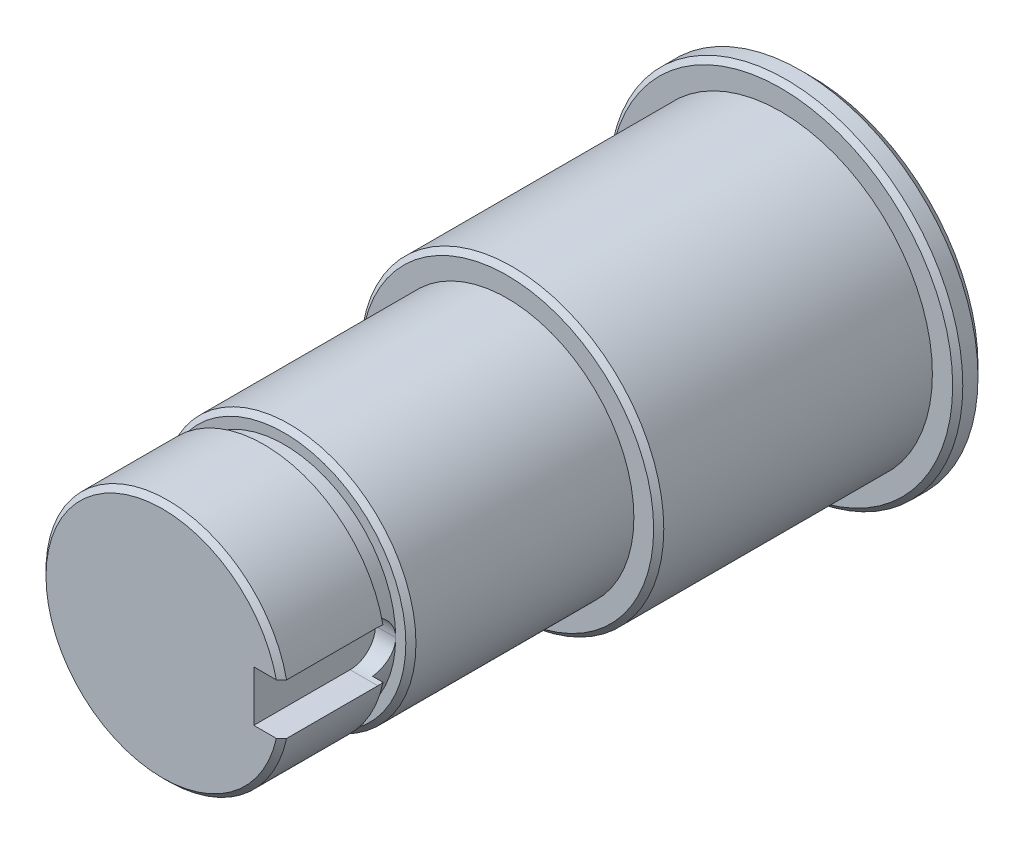
ISO-10303-21;
HEADER;
FILE_DESCRIPTION(('STEP AP214'),'2;1');
FILE_NAME('part.step','',(''),(''),'','','');
FILE_SCHEMA(('AUTOMOTIVE_DESIGN { 1 0 10303 214 1 1 1 1 }'));
ENDSEC;
DATA;
#1=APPLICATION_CONTEXT('core data for automotive mechanical design processes');
#2=APPLICATION_PROTOCOL_DEFINITION('international standard','automotive_design',2000,#1);
#3=PRODUCT_CONTEXT('',#1,'mechanical');
#4=PRODUCT('Part','Part','',(#3));
#5=PRODUCT_RELATED_PRODUCT_CATEGORY('part','',(#4));
#6=PRODUCT_DEFINITION_FORMATION('','',#4);
#7=PRODUCT_DEFINITION_CONTEXT('part definition',#1,'design');
#8=PRODUCT_DEFINITION('design','',#6,#7);
#9=PRODUCT_DEFINITION_SHAPE('','',#8);
#10=(LENGTH_UNIT() NAMED_UNIT(*) SI_UNIT(.MILLI.,.METRE.));
#11=(NAMED_UNIT(*) PLANE_ANGLE_UNIT() SI_UNIT($,.RADIAN.));
#12=(NAMED_UNIT(*) SI_UNIT($,.STERADIAN.) SOLID_ANGLE_UNIT());
#13=UNCERTAINTY_MEASURE_WITH_UNIT(LENGTH_MEASURE(1.E-05),#10,'distance_accuracy_value','');
#14=(GEOMETRIC_REPRESENTATION_CONTEXT(3) GLOBAL_UNCERTAINTY_ASSIGNED_CONTEXT((#13)) GLOBAL_UNIT_ASSIGNED_CONTEXT((#10,
#11,#12)) REPRESENTATION_CONTEXT('',''));
#15=CARTESIAN_POINT('',(0.,0.,0.));
#16=DIRECTION('',(0.,0.,1.));
#17=DIRECTION('',(1.,0.,0.));
#18=AXIS2_PLACEMENT_3D('',#15,#16,#17);
#19=CARTESIAN_POINT('',(0.,0.,52.));
#20=DIRECTION('',(0.,0.,1.));
#21=DIRECTION('',(1.,0.,0.));
#22=AXIS2_PLACEMENT_3D('',#19,#20,#21);
#23=PLANE('',#22);
#24=CARTESIAN_POINT('',(0.,0.,52.));
#25=DIRECTION('',(0.,0.,1.));
#26=DIRECTION('',(1.,0.,0.));
#27=AXIS2_PLACEMENT_3D('',#24,#25,#26);
#28=CIRCLE('',#27,11.);
#29=CARTESIAN_POINT('',(11.,0.,52.));
#30=VERTEX_POINT('',#29);
#31=EDGE_CURVE('E269',#30,#30,#28,.T.);
#32=ORIENTED_EDGE('',*,*,#31,.F.);
#33=EDGE_LOOP('',(#32));
#34=FACE_BOUND('',#33,.T.);
#35=CARTESIAN_POINT('',(0.,0.,52.));
#36=DIRECTION('',(0.,0.,1.));
#37=DIRECTION('',(1.,0.,0.));
#38=AXIS2_PLACEMENT_3D('',#35,#36,#37);
#39=CIRCLE('',#38,12.);
#40=CARTESIAN_POINT('',(12.,0.,52.));
#41=VERTEX_POINT('',#40);
#42=EDGE_CURVE('E233',#41,#41,#39,.T.);
#43=ORIENTED_EDGE('',*,*,#42,.T.);
#44=EDGE_LOOP('',(#43));
#45=FACE_BOUND('',#44,.T.);
#46=ADVANCED_FACE('F30',(#34,#45),#23,.T.);
#47=CARTESIAN_POINT('',(0.,0.,30.));
#48=DIRECTION('',(0.,0.,1.));
#49=DIRECTION('',(1.,0.,0.));
#50=AXIS2_PLACEMENT_3D('',#47,#48,#49);
#51=PLANE('',#50);
#52=CARTESIAN_POINT('',(0.,0.,30.));
#53=DIRECTION('',(0.,0.,1.));
#54=DIRECTION('',(1.,0.,0.));
#55=AXIS2_PLACEMENT_3D('',#52,#53,#54);
#56=CIRCLE('',#55,14.45);
#57=CARTESIAN_POINT('',(14.45,0.,30.));
#58=VERTEX_POINT('',#57);
#59=EDGE_CURVE('E220',#58,#58,#56,.T.);
#60=ORIENTED_EDGE('',*,*,#59,.T.);
#61=EDGE_LOOP('',(#60));
#62=FACE_BOUND('',#61,.T.);
#63=CARTESIAN_POINT('',(0.,0.,30.));
#64=DIRECTION('',(0.,0.,1.));
#65=DIRECTION('',(1.,0.,0.));
#66=AXIS2_PLACEMENT_3D('',#63,#64,#65);
#67=CIRCLE('',#66,12.5);
#68=CARTESIAN_POINT('',(12.5,0.,30.));
#69=VERTEX_POINT('',#68);
#70=EDGE_CURVE('E277',#69,#69,#67,.T.);
#71=ORIENTED_EDGE('',*,*,#70,.F.);
#72=EDGE_LOOP('',(#71));
#73=FACE_BOUND('',#72,.T.);
#74=ADVANCED_FACE('F187',(#62,#73),#51,.T.);
#75=CARTESIAN_POINT('',(0.,0.,3.));
#76=DIRECTION('',(0.,0.,1.));
#77=DIRECTION('',(1.,0.,0.));
#78=AXIS2_PLACEMENT_3D('',#75,#76,#77);
#79=PLANE('',#78);
#80=CARTESIAN_POINT('',(0.,0.,3.));
#81=DIRECTION('',(0.,0.,1.));
#82=DIRECTION('',(1.,0.,0.));
#83=AXIS2_PLACEMENT_3D('',#80,#81,#82);
#84=CIRCLE('',#83,16.95);
#85=CARTESIAN_POINT('',(16.95,0.,3.));
#86=VERTEX_POINT('',#85);
#87=EDGE_CURVE('E221',#86,#86,#84,.T.);
#88=ORIENTED_EDGE('',*,*,#87,.T.);
#89=EDGE_LOOP('',(#88));
#90=FACE_BOUND('',#89,.T.);
#91=CARTESIAN_POINT('',(0.,0.,3.));
#92=DIRECTION('',(0.,0.,1.));
#93=DIRECTION('',(1.,0.,0.));
#94=AXIS2_PLACEMENT_3D('',#91,#92,#93);
#95=CIRCLE('',#94,14.95);
#96=CARTESIAN_POINT('',(14.95,0.,3.));
#97=VERTEX_POINT('',#96);
#98=EDGE_CURVE('E280',#97,#97,#95,.T.);
#99=ORIENTED_EDGE('',*,*,#98,.F.);
#100=EDGE_LOOP('',(#99));
#101=FACE_BOUND('',#100,.T.);
#102=ADVANCED_FACE('F196',(#90,#101),#79,.T.);
#103=CARTESIAN_POINT('',(0.,0.,3.));
#104=DIRECTION('',(0.,0.,-1.));
#105=DIRECTION('',(-1.,0.,0.));
#106=AXIS2_PLACEMENT_3D('',#103,#104,#105);
#107=CYLINDRICAL_SURFACE('',#106,17.45);
#108=CARTESIAN_POINT('',(0.,0.,0.999999999999997));
#109=DIRECTION('',(0.,0.,1.));
#110=DIRECTION('',(1.,0.,0.));
#111=AXIS2_PLACEMENT_3D('',#108,#109,#110);
#112=CIRCLE('',#111,17.45);
#113=CARTESIAN_POINT('',(17.45,0.,0.999999999999997));
#114=VERTEX_POINT('',#113);
#115=EDGE_CURVE('E215',#114,#114,#112,.T.);
#116=ORIENTED_EDGE('',*,*,#115,.T.);
#117=EDGE_LOOP('',(#116));
#118=FACE_BOUND('',#117,.T.);
#119=CARTESIAN_POINT('',(0.,0.,2.5));
#120=DIRECTION('',(0.,0.,1.));
#121=DIRECTION('',(1.,0.,0.));
#122=AXIS2_PLACEMENT_3D('',#119,#120,#121);
#123=CIRCLE('',#122,17.45);
#124=CARTESIAN_POINT('',(17.45,0.,2.5));
#125=VERTEX_POINT('',#124);
#126=EDGE_CURVE('E218',#125,#125,#123,.F.);
#127=ORIENTED_EDGE('',*,*,#126,.T.);
#128=EDGE_LOOP('',(#127));
#129=FACE_BOUND('',#128,.T.);
#130=ADVANCED_FACE('F204',(#118,#129),#107,.T.);
#131=CARTESIAN_POINT('',(0.,0.,0.));
#132=DIRECTION('',(0.,0.,1.));
#133=DIRECTION('',(1.,0.,0.));
#134=AXIS2_PLACEMENT_3D('',#131,#132,#133);
#135=PLANE('',#134);
#136=CARTESIAN_POINT('',(0.,0.,0.));
#137=DIRECTION('',(0.,0.,1.));
#138=DIRECTION('',(1.,0.,0.));
#139=AXIS2_PLACEMENT_3D('',#136,#137,#138);
#140=CIRCLE('',#139,16.45);
#141=CARTESIAN_POINT('',(16.45,0.,0.));
#142=VERTEX_POINT('',#141);
#143=EDGE_CURVE('E240',#142,#142,#140,.F.);
#144=ORIENTED_EDGE('',*,*,#143,.T.);
#145=EDGE_LOOP('',(#144));
#146=FACE_BOUND('',#145,.T.);
#147=ADVANCED_FACE('F200',(#146),#135,.F.);
#148=CARTESIAN_POINT('',(0.,0.,30.));
#149=DIRECTION('',(0.,0.,-1.));
#150=DIRECTION('',(-1.,0.,0.));
#151=AXIS2_PLACEMENT_3D('',#148,#149,#150);
#152=CYLINDRICAL_SURFACE('',#151,14.95);
#153=CARTESIAN_POINT('',(0.,0.,29.5));
#154=DIRECTION('',(0.,0.,1.));
#155=DIRECTION('',(1.,0.,0.));
#156=AXIS2_PLACEMENT_3D('',#153,#154,#155);
#157=CIRCLE('',#156,14.95);
#158=CARTESIAN_POINT('',(14.95,0.,29.5));
#159=VERTEX_POINT('',#158);
#160=EDGE_CURVE('E224',#159,#159,#157,.F.);
#161=ORIENTED_EDGE('',*,*,#160,.T.);
#162=EDGE_LOOP('',(#161));
#163=FACE_BOUND('',#162,.T.);
#164=ORIENTED_EDGE('',*,*,#98,.T.);
#165=EDGE_LOOP('',(#164));
#166=FACE_BOUND('',#165,.T.);
#167=ADVANCED_FACE('F192',(#163,#166),#152,.T.);
#168=CARTESIAN_POINT('',(0.,0.,52.));
#169=DIRECTION('',(0.,0.,-1.));
#170=DIRECTION('',(-1.,0.,0.));
#171=AXIS2_PLACEMENT_3D('',#168,#169,#170);
#172=CYLINDRICAL_SURFACE('',#171,12.5);
#173=CARTESIAN_POINT('',(0.,0.,51.5));
#174=DIRECTION('',(0.,0.,1.));
#175=DIRECTION('',(1.,0.,0.));
#176=AXIS2_PLACEMENT_3D('',#173,#174,#175);
#177=CIRCLE('',#176,12.5);
#178=CARTESIAN_POINT('',(12.5,0.,51.5));
#179=VERTEX_POINT('',#178);
#180=EDGE_CURVE('E236',#179,#179,#177,.F.);
#181=ORIENTED_EDGE('',*,*,#180,.T.);
#182=EDGE_LOOP('',(#181));
#183=FACE_BOUND('',#182,.T.);
#184=ORIENTED_EDGE('',*,*,#70,.T.);
#185=EDGE_LOOP('',(#184));
#186=FACE_BOUND('',#185,.T.);
#187=ADVANCED_FACE('F189',(#183,#186),#172,.T.);
#188=CARTESIAN_POINT('',(-12.,0.,54.));
#189=DIRECTION('',(0.,0.,-1.));
#190=DIRECTION('',(-1.,0.,0.));
#191=AXIS2_PLACEMENT_3D('',#188,#189,#190);
#192=PLANE('',#191);
#193=CARTESIAN_POINT('',(0.,0.,54.));
#194=DIRECTION('',(0.,0.,1.));
#195=DIRECTION('',(1.,0.,0.));
#196=AXIS2_PLACEMENT_3D('',#193,#194,#195);
#197=CIRCLE('',#196,12.);
#198=CARTESIAN_POINT('',(11.7473401244707,2.44948974278318,54.));
#199=VERTEX_POINT('',#198);
#200=CARTESIAN_POINT('',(11.7473401244707,-2.44948974278318,54.));
#201=VERTEX_POINT('',#200);
#202=EDGE_CURVE('E53',#199,#201,#197,.T.);
#203=ORIENTED_EDGE('',*,*,#202,.F.);
#204=DIRECTION('',(1.,0.,0.));
#205=VECTOR('',#204,1.);
#206=CARTESIAN_POINT('',(11.7473401244707,2.44948974278318,54.));
#207=LINE('',#206,#205);
#208=CARTESIAN_POINT('',(10.7238052947636,2.44948974278318,54.));
#209=VERTEX_POINT('',#208);
#210=EDGE_CURVE('E40',#199,#209,#207,.F.);
#211=ORIENTED_EDGE('',*,*,#210,.T.);
#212=CARTESIAN_POINT('',(0.,0.,54.));
#213=DIRECTION('',(0.,0.,1.));
#214=DIRECTION('',(1.,0.,0.));
#215=AXIS2_PLACEMENT_3D('',#212,#213,#214);
#216=CIRCLE('',#215,11.);
#217=CARTESIAN_POINT('',(10.7238052947636,-2.44948974278318,54.));
#218=VERTEX_POINT('',#217);
#219=EDGE_CURVE('E46',#209,#218,#216,.T.);
#220=ORIENTED_EDGE('',*,*,#219,.T.);
#221=DIRECTION('',(1.,0.,0.));
#222=VECTOR('',#221,1.);
#223=CARTESIAN_POINT('',(10.7238052947636,-2.44948974278318,54.));
#224=LINE('',#223,#222);
#225=EDGE_CURVE('E251',#218,#201,#224,.T.);
#226=ORIENTED_EDGE('',*,*,#225,.T.);
#227=EDGE_LOOP('',(#203,#211,#220,#226));
#228=FACE_BOUND('',#227,.T.);
#229=ADVANCED_FACE('F153',(#228),#192,.T.);
#230=CARTESIAN_POINT('',(0.,0.,52.));
#231=DIRECTION('',(0.,0.,1.));
#232=DIRECTION('',(1.,0.,0.));
#233=AXIS2_PLACEMENT_3D('',#230,#231,#232);
#234=CYLINDRICAL_SURFACE('',#233,11.);
#235=ORIENTED_EDGE('',*,*,#219,.F.);
#236=CARTESIAN_POINT('',(10.7238052947636,2.44948974278318,54.));
#237=CARTESIAN_POINT('',(10.7270051705199,2.43546225899013,53.931243733876));
#238=CARTESIAN_POINT('',(10.7308472430649,2.4185332172087,53.863116600116));
#239=CARTESIAN_POINT('',(10.7396733144426,2.37904398302326,53.7286032390525));
#240=CARTESIAN_POINT('',(10.7446571019522,2.35648483264183,53.6622166921103));
#241=CARTESIAN_POINT('',(10.7556191746092,2.30593085549429,53.5317157686606));
#242=CARTESIAN_POINT('',(10.7615963199518,2.27794225253788,53.4675988889972));
#243=CARTESIAN_POINT('',(10.7743690019728,2.21674323751611,53.3420124820564));
#244=CARTESIAN_POINT('',(10.7811645590626,2.18353269520733,53.2805430208586));
#245=CARTESIAN_POINT('',(10.8024886103983,2.07642538610296,53.1007598772238));
#246=CARTESIAN_POINT('',(10.8179673183631,1.99499657533367,52.9869265661249));
#247=CARTESIAN_POINT('',(10.8497084698245,1.81444249446593,52.7745283943104));
#248=CARTESIAN_POINT('',(10.8659708929459,1.71531768425152,52.6759631369326));
#249=CARTESIAN_POINT('',(10.8977266444628,1.50049814289524,52.4953906129537));
#250=CARTESIAN_POINT('',(10.9132064310626,1.38459554614731,52.4136279435977));
#251=CARTESIAN_POINT('',(10.9414244876216,1.14030197084631,52.2707153825588));
#252=CARTESIAN_POINT('',(10.9541625336447,1.01190997344301,52.2095671743658));
#253=CARTESIAN_POINT('',(10.9704105104604,0.809351066191613,52.1334524532352));
#254=CARTESIAN_POINT('',(10.9754351831543,0.738267522283218,52.1103238093824));
#255=CARTESIAN_POINT('',(10.9841751056629,0.594217360443672,52.0704974185992));
#256=CARTESIAN_POINT('',(10.9878902975281,0.521250659328935,52.0537999562701));
#257=CARTESIAN_POINT('',(10.9938910426588,0.373896866857208,52.0269815155051));
#258=CARTESIAN_POINT('',(10.9961734033692,0.2995069815037,52.0168752212132));
#259=CARTESIAN_POINT('',(10.9992322885864,0.150080006961188,52.0033786463336));
#260=CARTESIAN_POINT('',(11.0000086070291,0.0750428306172656,51.9999892847885));
#261=CARTESIAN_POINT('',(11.,0.,52.));
#262=B_SPLINE_CURVE_WITH_KNOTS('',3,(#236,#237,#238,#239,#240,#241,#242,#243,#244,#245,#246,
#247,#248,#249,#250,#251,#252,#253,#254,#255,#256,#257,#258,#259,#260,#261),.UNSPECIFIED.,.F.,
.F.,(4,2,2,2,2,2,2,2,2,2,2,2,4),(0.,0.210660221626532,0.421281483058337,0.63166271990242,
0.842049204819849,1.26236009853302,1.68266007078708,2.10870184822357,2.5347784101445,
2.75927755192977,2.98378662741285,3.20879418251605,3.43383252209369),.UNSPECIFIED.);
#263=EDGE_CURVE('E11',#209,#30,#262,.T.);
#264=ORIENTED_EDGE('',*,*,#263,.T.);
#265=ORIENTED_EDGE('',*,*,#31,.T.);
#266=CARTESIAN_POINT('',(11.,0.,52.));
#267=CARTESIAN_POINT('',(11.0000062631547,-0.0693593814594331,51.999992262271));
#268=CARTESIAN_POINT('',(10.9993441314012,-0.138714425845162,52.0028863317969));
#269=CARTESIAN_POINT('',(10.9967294954615,-0.276911622073989,52.0144181134769));
#270=CARTESIAN_POINT('',(10.9947771685423,-0.345753843062841,52.0230550365901));
#271=CARTESIAN_POINT('',(10.9896323569216,-0.482339061487069,52.0459955464892));
#272=CARTESIAN_POINT('',(10.9864417172471,-0.550083538801369,52.060290703403));
#273=CARTESIAN_POINT('',(10.9789138060964,-0.684078822224272,52.0944184625271));
#274=CARTESIAN_POINT('',(10.9745765265885,-0.750329617866718,52.1142511035254));
#275=CARTESIAN_POINT('',(10.9600119469312,-0.946146681937328,52.1818475254434));
#276=CARTESIAN_POINT('',(10.9482269417514,-1.07290109579769,52.237730718352));
#277=CARTESIAN_POINT('',(10.9217780612989,-1.31516951073418,52.3694206862865));
#278=CARTESIAN_POINT('',(10.9071141049751,-1.43068319521313,52.4452280222572));
#279=CARTESIAN_POINT('',(10.8762285824708,-1.64924932157864,52.6159878880607));
#280=CARTESIAN_POINT('',(10.8599865626537,-1.75208327323788,52.7112164268576));
#281=CARTESIAN_POINT('',(10.8279077936482,-1.94050909601812,52.9176173677905));
#282=CARTESIAN_POINT('',(10.8120711580757,-2.02609617860548,53.0287941832835));
#283=CARTESIAN_POINT('',(10.7892162201439,-2.14350613360819,53.2110736899603));
#284=CARTESIAN_POINT('',(10.7814318234941,-2.18221189191062,53.2777490533691));
#285=CARTESIAN_POINT('',(10.7667875194561,-2.25335381628221,53.4144908101737));
#286=CARTESIAN_POINT('',(10.7599276761639,-2.28578954774089,53.4845574382164));
#287=CARTESIAN_POINT('',(10.7473696764176,-2.34413060685169,53.6276291755192));
#288=CARTESIAN_POINT('',(10.7416739914829,-2.37002206795435,53.7006401504273));
#289=CARTESIAN_POINT('',(10.731658229854,-2.4149547687399,53.8488438458625));
#290=CARTESIAN_POINT('',(10.7273383743449,-2.43399490703441,53.9240369150758));
#291=CARTESIAN_POINT('',(10.7238052947636,-2.44948974278318,54.));
#292=B_SPLINE_CURVE_WITH_KNOTS('',3,(#266,#267,#268,#269,#270,#271,#272,#273,#274,#275,#276,
#277,#278,#279,#280,#281,#282,#283,#284,#285,#286,#287,#288,#289,#290,#291),.UNSPECIFIED.,.F.,
.F.,(4,2,2,2,2,2,2,2,2,2,2,2,4),(0.,0.208007086133319,0.415985598977218,0.623655416077708,
0.831326687858949,1.24629798955501,1.66128097561199,2.08263375686062,2.50410336455458,
2.73628198310806,2.96847668948851,3.20115934119784,3.43387938124956),.UNSPECIFIED.);
#293=EDGE_CURVE('E157',#30,#218,#292,.T.);
#294=ORIENTED_EDGE('',*,*,#293,.T.);
#295=EDGE_LOOP('',(#235,#264,#265,#294));
#296=FACE_BOUND('',#295,.T.);
#297=ADVANCED_FACE('F149',(#296),#234,.T.);
#298=CARTESIAN_POINT('',(0.,0.,64.));
#299=DIRECTION('',(0.,0.,1.));
#300=DIRECTION('',(1.,0.,0.));
#301=AXIS2_PLACEMENT_3D('',#298,#299,#300);
#302=PLANE('',#301);
#303=DIRECTION('',(1.,0.,0.));
#304=VECTOR('',#303,1.);
#305=CARTESIAN_POINT('',(9.,2.5,64.));
#306=LINE('',#305,#304);
#307=CARTESIAN_POINT('',(9.,2.5,64.));
#308=VERTEX_POINT('',#307);
#309=CARTESIAN_POINT('',(11.2249721603218,2.5,64.));
#310=VERTEX_POINT('',#309);
#311=EDGE_CURVE('E122',#308,#310,#306,.T.);
#312=ORIENTED_EDGE('',*,*,#311,.T.);
#313=CARTESIAN_POINT('',(0.,0.,64.));
#314=DIRECTION('',(0.,0.,1.));
#315=DIRECTION('',(1.,0.,0.));
#316=AXIS2_PLACEMENT_3D('',#313,#314,#315);
#317=CIRCLE('',#316,11.5);
#318=CARTESIAN_POINT('',(11.2249721603218,-2.5,64.));
#319=VERTEX_POINT('',#318);
#320=EDGE_CURVE('E121',#310,#319,#317,.T.);
#321=ORIENTED_EDGE('',*,*,#320,.T.);
#322=DIRECTION('',(1.,0.,0.));
#323=VECTOR('',#322,1.);
#324=CARTESIAN_POINT('',(9.,-2.5,64.));
#325=LINE('',#324,#323);
#326=CARTESIAN_POINT('',(9.,-2.5,64.));
#327=VERTEX_POINT('',#326);
#328=EDGE_CURVE('E103',#327,#319,#325,.T.);
#329=ORIENTED_EDGE('',*,*,#328,.F.);
#330=DIRECTION('',(0.,-1.,0.));
#331=VECTOR('',#330,1.);
#332=CARTESIAN_POINT('',(9.,2.5,64.));
#333=LINE('',#332,#331);
#334=EDGE_CURVE('E109',#308,#327,#333,.T.);
#335=ORIENTED_EDGE('',*,*,#334,.F.);
#336=EDGE_LOOP('',(#312,#321,#329,#335));
#337=FACE_BOUND('',#336,.T.);
#338=ADVANCED_FACE('F119',(#337),#302,.T.);
#339=CARTESIAN_POINT('',(0.,0.,64.));
#340=DIRECTION('',(0.,0.,-1.));
#341=DIRECTION('',(-1.,0.,0.));
#342=AXIS2_PLACEMENT_3D('',#339,#340,#341);
#343=CONICAL_SURFACE('',#342,11.5,0.785398163397453);
#344=CARTESIAN_POINT('',(15.1691571018034,2.5,60.1262129851103));
#345=CARTESIAN_POINT('',(14.8366974693419,2.5,60.4542453168993));
#346=CARTESIAN_POINT('',(14.5040984318175,2.5,60.7821362155037));
#347=CARTESIAN_POINT('',(13.8385504552705,2.5,61.4375624320659));
#348=CARTESIAN_POINT('',(13.5056015163793,2.5,61.7650977501572));
#349=CARTESIAN_POINT('',(12.5061389650566,2.5,62.747045785368));
#350=CARTESIAN_POINT('',(11.838993529945,2.5,63.4008164710457));
#351=CARTESIAN_POINT('',(10.8362127583897,2.5,64.3793762260795));
#352=CARTESIAN_POINT('',(10.5016044799481,2.5,64.7052175462295));
#353=CARTESIAN_POINT('',(9.83147783642997,2.5,65.355961176446));
#354=CARTESIAN_POINT('',(9.4959594743738,2.5,65.6808634896214));
#355=CARTESIAN_POINT('',(8.82369277325788,2.5,66.3294114340962));
#356=CARTESIAN_POINT('',(8.48694440368586,2.5,66.6530570338044));
#357=CARTESIAN_POINT('',(7.98054105571632,2.5,67.137189767392));
#358=CARTESIAN_POINT('',(7.81152552701382,2.5,67.2983456301893));
#359=CARTESIAN_POINT('',(7.47297586457761,2.5,67.6201126903092));
#360=CARTESIAN_POINT('',(7.30344172917183,2.5,67.7807238858721));
#361=CARTESIAN_POINT('',(7.13360268921152,2.5,67.9410128107315));
#362=B_SPLINE_CURVE_WITH_KNOTS('',3,(#344,#345,#346,#347,#348,#349,#350,#351,#352,#353,#354,
#355,#356,#357,#358,#359,#360,#361),.UNSPECIFIED.,.F.,.F.,(4,2,2,2,2,2,2,2,4),(0.,
1.40114621158888,2.80229189732206,5.60451543695996,7.0056627030127,8.40680532469229,
9.80798294323778,10.5085795747689,11.2091784675359),.UNSPECIFIED.);
#363=CARTESIAN_POINT('',(11.7366945943055,2.5,63.5));
#364=VERTEX_POINT('',#363);
#365=EDGE_CURVE('E268',#364,#310,#362,.T.);
#366=ORIENTED_EDGE('',*,*,#365,.F.);
#367=CARTESIAN_POINT('',(0.,0.,63.5));
#368=DIRECTION('',(0.,0.,1.));
#369=DIRECTION('',(1.,0.,0.));
#370=AXIS2_PLACEMENT_3D('',#367,#368,#369);
#371=CIRCLE('',#370,12.);
#372=CARTESIAN_POINT('',(11.7366945943055,-2.5,63.5));
#373=VERTEX_POINT('',#372);
#374=EDGE_CURVE('E227',#373,#364,#371,.F.);
#375=ORIENTED_EDGE('',*,*,#374,.F.);
#376=CARTESIAN_POINT('',(7.13360268921151,-2.5,67.9410128107315));
#377=CARTESIAN_POINT('',(7.30344172917183,-2.5,67.7807238858721));
#378=CARTESIAN_POINT('',(7.47297586457762,-2.5,67.6201126903092));
#379=CARTESIAN_POINT('',(7.81152552701382,-2.5,67.2983456301893));
#380=CARTESIAN_POINT('',(7.98054105571632,-2.5,67.137189767392));
#381=CARTESIAN_POINT('',(8.48694440368586,-2.5,66.6530570338044));
#382=CARTESIAN_POINT('',(8.82369277325788,-2.5,66.3294114340962));
#383=CARTESIAN_POINT('',(9.4959594743738,-2.5,65.6808634896214));
#384=CARTESIAN_POINT('',(9.83147783642996,-2.5,65.355961176446));
#385=CARTESIAN_POINT('',(10.5016044799481,-2.5,64.7052175462295));
#386=CARTESIAN_POINT('',(10.8362127583897,-2.5,64.3793762260795));
#387=CARTESIAN_POINT('',(11.838993529945,-2.5,63.4008164710457));
#388=CARTESIAN_POINT('',(12.5061389650566,-2.5,62.747045785368));
#389=CARTESIAN_POINT('',(13.5056015163793,-2.5,61.7650977501572));
#390=CARTESIAN_POINT('',(13.8385504552705,-2.5,61.4375624320659));
#391=CARTESIAN_POINT('',(14.5040984318175,-2.5,60.7821362155037));
#392=CARTESIAN_POINT('',(14.8366974693419,-2.5,60.4542453168993));
#393=CARTESIAN_POINT('',(15.1691571018033,-2.5,60.1262129851103));
#394=B_SPLINE_CURVE_WITH_KNOTS('',3,(#376,#377,#378,#379,#380,#381,#382,#383,#384,#385,#386,
#387,#388,#389,#390,#391,#392,#393),.UNSPECIFIED.,.F.,.F.,(4,2,2,2,2,2,2,2,4),(0.,
0.700598892766991,1.4011955242981,2.80237314284359,4.20351576452318,5.60466303057592,
8.40688657021382,9.808032255947,11.2091784675359),.UNSPECIFIED.);
#395=EDGE_CURVE('E129',#319,#373,#394,.T.);
#396=ORIENTED_EDGE('',*,*,#395,.F.);
#397=ORIENTED_EDGE('',*,*,#320,.F.);
#398=EDGE_LOOP('',(#366,#375,#396,#397));
#399=FACE_BOUND('',#398,.T.);
#400=ADVANCED_FACE('F138',(#399),#343,.T.);
#401=CARTESIAN_POINT('',(0.,0.,64.));
#402=DIRECTION('',(0.,0.,-1.));
#403=DIRECTION('',(-1.,0.,0.));
#404=AXIS2_PLACEMENT_3D('',#401,#402,#403);
#405=CYLINDRICAL_SURFACE('',#404,12.);
#406=ORIENTED_EDGE('',*,*,#374,.T.);
#407=DIRECTION('',(0.,0.,-1.));
#408=VECTOR('',#407,1.);
#409=CARTESIAN_POINT('',(11.7366945943055,2.5,64.));
#410=LINE('',#409,#408);
#411=CARTESIAN_POINT('',(11.7366945943055,2.5,54.5));
#412=VERTEX_POINT('',#411);
#413=EDGE_CURVE('E136',#364,#412,#410,.T.);
#414=ORIENTED_EDGE('',*,*,#413,.T.);
#415=CARTESIAN_POINT('',(11.7366945943055,2.5,54.5));
#416=CARTESIAN_POINT('',(11.7367140999484,2.49997489475119,54.4157814133649));
#417=CARTESIAN_POINT('',(11.7376109802893,2.49575315399786,54.3320054532456));
#418=CARTESIAN_POINT('',(11.7411594903559,2.47891640153729,54.1653387865848));
#419=CARTESIAN_POINT('',(11.74381112007,2.46630138988501,54.0824480800373));
#420=CARTESIAN_POINT('',(11.7473401244707,2.44948974278318,54.));
#421=B_SPLINE_CURVE_WITH_KNOTS('',3,(#415,#416,#417,#418,#419,#420),.UNSPECIFIED.,.F.,.F.,(4,2,
4),(0.,0.251661182642634,0.503322363637159),.UNSPECIFIED.);
#422=EDGE_CURVE('E168',#412,#199,#421,.T.);
#423=ORIENTED_EDGE('',*,*,#422,.T.);
#424=ORIENTED_EDGE('',*,*,#202,.T.);
#425=CARTESIAN_POINT('',(11.7473401244707,-2.44948974278318,54.));
#426=CARTESIAN_POINT('',(11.74381112007,-2.46630138988501,54.0824480800373));
#427=CARTESIAN_POINT('',(11.7411594903559,-2.47891640153729,54.1653387865848));
#428=CARTESIAN_POINT('',(11.7376109802893,-2.49575315399786,54.3320054532456));
#429=CARTESIAN_POINT('',(11.7367140999484,-2.49997489475119,54.4157814133649));
#430=CARTESIAN_POINT('',(11.7366945943055,-2.5,54.5));
#431=B_SPLINE_CURVE_WITH_KNOTS('',3,(#425,#426,#427,#428,#429,#430),.UNSPECIFIED.,.F.,.F.,(4,2,
4),(0.,0.251661180994525,0.503322363637159),.UNSPECIFIED.);
#432=CARTESIAN_POINT('',(11.7366945943055,-2.5,54.5));
#433=VERTEX_POINT('',#432);
#434=EDGE_CURVE('E174',#201,#433,#431,.T.);
#435=ORIENTED_EDGE('',*,*,#434,.T.);
#436=DIRECTION('',(0.,0.,-1.));
#437=VECTOR('',#436,1.);
#438=CARTESIAN_POINT('',(11.7366945943055,-2.5,64.));
#439=LINE('',#438,#437);
#440=EDGE_CURVE('E124',#433,#373,#439,.F.);
#441=ORIENTED_EDGE('',*,*,#440,.T.);
#442=EDGE_LOOP('',(#406,#414,#423,#424,#435,#441));
#443=FACE_BOUND('',#442,.T.);
#444=ADVANCED_FACE('F178',(#443),#405,.T.);
#445=CARTESIAN_POINT('',(0.,0.,3.));
#446=DIRECTION('',(0.,0.,-1.));
#447=DIRECTION('',(-1.,0.,0.));
#448=AXIS2_PLACEMENT_3D('',#445,#446,#447);
#449=CONICAL_SURFACE('',#448,16.95,0.785398163397445);
#450=ORIENTED_EDGE('',*,*,#126,.F.);
#451=EDGE_LOOP('',(#450));
#452=FACE_BOUND('',#451,.T.);
#453=ORIENTED_EDGE('',*,*,#87,.F.);
#454=EDGE_LOOP('',(#453));
#455=FACE_BOUND('',#454,.T.);
#456=ADVANCED_FACE('F182',(#452,#455),#449,.T.);
#457=CARTESIAN_POINT('',(0.,0.,30.));
#458=DIRECTION('',(0.,0.,-1.));
#459=DIRECTION('',(-1.,0.,0.));
#460=AXIS2_PLACEMENT_3D('',#457,#458,#459);
#461=CONICAL_SURFACE('',#460,14.45,0.785398163397464);
#462=ORIENTED_EDGE('',*,*,#160,.F.);
#463=EDGE_LOOP('',(#462));
#464=FACE_BOUND('',#463,.T.);
#465=ORIENTED_EDGE('',*,*,#59,.F.);
#466=EDGE_LOOP('',(#465));
#467=FACE_BOUND('',#466,.T.);
#468=ADVANCED_FACE('F295',(#464,#467),#461,.T.);
#469=CARTESIAN_POINT('',(0.,0.,52.));
#470=DIRECTION('',(0.,0.,-1.));
#471=DIRECTION('',(-1.,0.,0.));
#472=AXIS2_PLACEMENT_3D('',#469,#470,#471);
#473=CONICAL_SURFACE('',#472,12.,0.785398163397459);
#474=ORIENTED_EDGE('',*,*,#180,.F.);
#475=EDGE_LOOP('',(#474));
#476=FACE_BOUND('',#475,.T.);
#477=ORIENTED_EDGE('',*,*,#42,.F.);
#478=EDGE_LOOP('',(#477));
#479=FACE_BOUND('',#478,.T.);
#480=ADVANCED_FACE('F292',(#476,#479),#473,.T.);
#481=CARTESIAN_POINT('',(0.,0.,0.999999999999997));
#482=DIRECTION('',(0.,0.,1.));
#483=DIRECTION('',(1.,0.,0.));
#484=AXIS2_PLACEMENT_3D('',#481,#482,#483);
#485=CONICAL_SURFACE('',#484,17.45,0.78539816339745);
#486=ORIENTED_EDGE('',*,*,#143,.F.);
#487=EDGE_LOOP('',(#486));
#488=FACE_BOUND('',#487,.T.);
#489=ORIENTED_EDGE('',*,*,#115,.F.);
#490=EDGE_LOOP('',(#489));
#491=FACE_BOUND('',#490,.T.);
#492=ADVANCED_FACE('F294',(#488,#491),#485,.T.);
#493=CARTESIAN_POINT('',(9.,2.5,64.));
#494=DIRECTION('',(0.,1.,0.));
#495=DIRECTION('',(0.,0.,1.));
#496=AXIS2_PLACEMENT_3D('',#493,#494,#495);
#497=PLANE('',#496);
#498=DIRECTION('',(0.,0.,1.));
#499=VECTOR('',#498,1.);
#500=CARTESIAN_POINT('',(9.,2.5,64.));
#501=LINE('',#500,#499);
#502=CARTESIAN_POINT('',(9.,2.5,54.5));
#503=VERTEX_POINT('',#502);
#504=EDGE_CURVE('E108',#503,#308,#501,.T.);
#505=ORIENTED_EDGE('',*,*,#504,.F.);
#506=DIRECTION('',(1.,0.,0.));
#507=VECTOR('',#506,1.);
#508=CARTESIAN_POINT('',(9.,2.5,54.5));
#509=LINE('',#508,#507);
#510=EDGE_CURVE('E247',#503,#412,#509,.T.);
#511=ORIENTED_EDGE('',*,*,#510,.T.);
#512=ORIENTED_EDGE('',*,*,#413,.F.);
#513=ORIENTED_EDGE('',*,*,#365,.T.);
#514=ORIENTED_EDGE('',*,*,#311,.F.);
#515=EDGE_LOOP('',(#505,#511,#512,#513,#514));
#516=FACE_BOUND('',#515,.T.);
#517=ADVANCED_FACE('F146',(#516),#497,.F.);
#518=CARTESIAN_POINT('',(9.,-2.5,64.));
#519=DIRECTION('',(0.,-1.,0.));
#520=DIRECTION('',(0.,0.,-1.));
#521=AXIS2_PLACEMENT_3D('',#518,#519,#520);
#522=PLANE('',#521);
#523=ORIENTED_EDGE('',*,*,#440,.F.);
#524=DIRECTION('',(1.,0.,0.));
#525=VECTOR('',#524,1.);
#526=CARTESIAN_POINT('',(9.,-2.5,54.5));
#527=LINE('',#526,#525);
#528=CARTESIAN_POINT('',(9.,-2.5,54.5));
#529=VERTEX_POINT('',#528);
#530=EDGE_CURVE('E106',#433,#529,#527,.F.);
#531=ORIENTED_EDGE('',*,*,#530,.T.);
#532=DIRECTION('',(0.,0.,-1.));
#533=VECTOR('',#532,1.);
#534=CARTESIAN_POINT('',(9.,-2.5,64.));
#535=LINE('',#534,#533);
#536=EDGE_CURVE('E97',#327,#529,#535,.T.);
#537=ORIENTED_EDGE('',*,*,#536,.F.);
#538=ORIENTED_EDGE('',*,*,#328,.T.);
#539=ORIENTED_EDGE('',*,*,#395,.T.);
#540=EDGE_LOOP('',(#523,#531,#537,#538,#539));
#541=FACE_BOUND('',#540,.T.);
#542=ADVANCED_FACE('F100',(#541),#522,.F.);
#543=CARTESIAN_POINT('',(9.,2.5,64.));
#544=DIRECTION('',(1.,0.,0.));
#545=DIRECTION('',(0.,0.,-1.));
#546=AXIS2_PLACEMENT_3D('',#543,#544,#545);
#547=PLANE('',#546);
#548=ORIENTED_EDGE('',*,*,#536,.T.);
#549=CARTESIAN_POINT('',(9.,0.,54.5));
#550=DIRECTION('',(1.,0.,0.));
#551=DIRECTION('',(0.,0.,-1.));
#552=AXIS2_PLACEMENT_3D('',#549,#550,#551);
#553=CIRCLE('',#552,2.5);
#554=CARTESIAN_POINT('',(9.,0.,52.));
#555=VERTEX_POINT('',#554);
#556=EDGE_CURVE('E246',#529,#555,#553,.T.);
#557=ORIENTED_EDGE('',*,*,#556,.T.);
#558=CARTESIAN_POINT('',(9.,0.,54.5));
#559=DIRECTION('',(1.,0.,0.));
#560=DIRECTION('',(0.,0.,-1.));
#561=AXIS2_PLACEMENT_3D('',#558,#559,#560);
#562=CIRCLE('',#561,2.5);
#563=EDGE_CURVE('E244',#555,#503,#562,.T.);
#564=ORIENTED_EDGE('',*,*,#563,.T.);
#565=ORIENTED_EDGE('',*,*,#504,.T.);
#566=ORIENTED_EDGE('',*,*,#334,.T.);
#567=EDGE_LOOP('',(#548,#557,#564,#565,#566));
#568=FACE_BOUND('',#567,.T.);
#569=ADVANCED_FACE('F112',(#568),#547,.T.);
#570=CARTESIAN_POINT('',(9.,0.,54.5));
#571=DIRECTION('',(1.,0.,0.));
#572=DIRECTION('',(0.,0.,-1.));
#573=AXIS2_PLACEMENT_3D('',#570,#571,#572);
#574=CYLINDRICAL_SURFACE('',#573,2.5);
#575=ORIENTED_EDGE('',*,*,#510,.F.);
#576=ORIENTED_EDGE('',*,*,#563,.F.);
#577=DIRECTION('',(1.,0.,0.));
#578=VECTOR('',#577,1.);
#579=CARTESIAN_POINT('',(0.,0.,52.));
#580=LINE('',#579,#578);
#581=EDGE_CURVE('E35',#30,#555,#580,.F.);
#582=ORIENTED_EDGE('',*,*,#581,.F.);
#583=ORIENTED_EDGE('',*,*,#263,.F.);
#584=ORIENTED_EDGE('',*,*,#210,.F.);
#585=ORIENTED_EDGE('',*,*,#422,.F.);
#586=EDGE_LOOP('',(#575,#576,#582,#583,#584,#585));
#587=FACE_BOUND('',#586,.T.);
#588=ADVANCED_FACE('F32',(#587),#574,.F.);
#589=CARTESIAN_POINT('',(0.,0.,54.5));
#590=DIRECTION('',(1.,0.,0.));
#591=DIRECTION('',(0.,0.,-1.));
#592=AXIS2_PLACEMENT_3D('',#589,#590,#591);
#593=CYLINDRICAL_SURFACE('',#592,2.5);
#594=ORIENTED_EDGE('',*,*,#556,.F.);
#595=ORIENTED_EDGE('',*,*,#530,.F.);
#596=ORIENTED_EDGE('',*,*,#434,.F.);
#597=ORIENTED_EDGE('',*,*,#225,.F.);
#598=ORIENTED_EDGE('',*,*,#293,.F.);
#599=ORIENTED_EDGE('',*,*,#581,.T.);
#600=EDGE_LOOP('',(#594,#595,#596,#597,#598,#599));
#601=FACE_BOUND('',#600,.T.);
#602=ADVANCED_FACE('F259',(#601),#593,.F.);
#603=CLOSED_SHELL('',(#46,#74,#102,#130,#147,#167,#187,#229,#297,#338,#400,#444,#456,#468,#480,
#492,#517,#542,#569,#588,#602));
#604=MANIFOLD_SOLID_BREP('B2',#603);
#605=ADVANCED_BREP_SHAPE_REPRESENTATION('',(#18,#604),#14);
#606=SHAPE_DEFINITION_REPRESENTATION(#9,#605);
ENDSEC;
END-ISO-10303-21;
